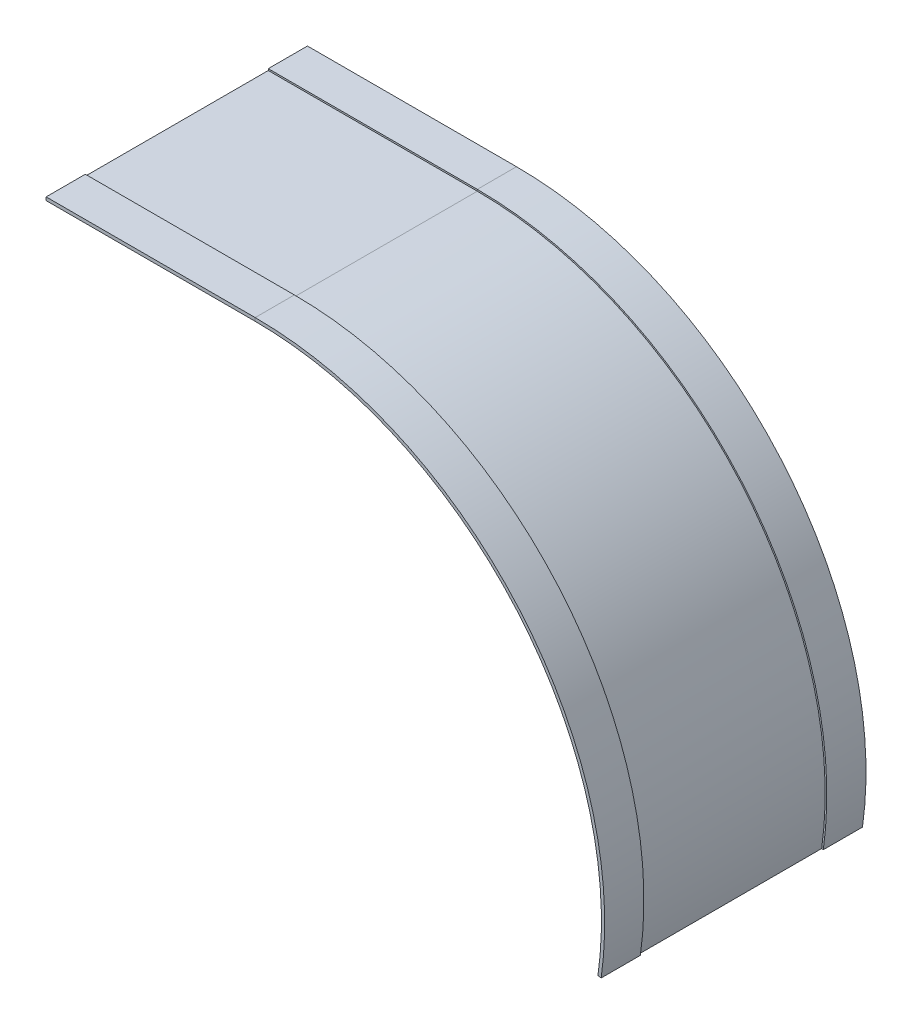
ISO-10303-21;
HEADER;
FILE_DESCRIPTION(('STEP AP214'),'2;1');
FILE_NAME('part.step','',(''),(''),'','','');
FILE_SCHEMA(('AUTOMOTIVE_DESIGN { 1 0 10303 214 1 1 1 1 }'));
ENDSEC;
DATA;
#1=APPLICATION_CONTEXT('core data for automotive mechanical design processes');
#2=APPLICATION_PROTOCOL_DEFINITION('international standard','automotive_design',2000,#1);
#3=PRODUCT_CONTEXT('',#1,'mechanical');
#4=PRODUCT('Part','Part','',(#3));
#5=PRODUCT_RELATED_PRODUCT_CATEGORY('part','',(#4));
#6=PRODUCT_DEFINITION_FORMATION('','',#4);
#7=PRODUCT_DEFINITION_CONTEXT('part definition',#1,'design');
#8=PRODUCT_DEFINITION('design','',#6,#7);
#9=PRODUCT_DEFINITION_SHAPE('','',#8);
#10=(LENGTH_UNIT() NAMED_UNIT(*) SI_UNIT(.MILLI.,.METRE.));
#11=(NAMED_UNIT(*) PLANE_ANGLE_UNIT() SI_UNIT($,.RADIAN.));
#12=(NAMED_UNIT(*) SI_UNIT($,.STERADIAN.) SOLID_ANGLE_UNIT());
#13=UNCERTAINTY_MEASURE_WITH_UNIT(LENGTH_MEASURE(1.E-05),#10,'distance_accuracy_value','');
#14=(GEOMETRIC_REPRESENTATION_CONTEXT(3) GLOBAL_UNCERTAINTY_ASSIGNED_CONTEXT((#13)) GLOBAL_UNIT_ASSIGNED_CONTEXT((#10,
#11,#12)) REPRESENTATION_CONTEXT('',''));
#15=CARTESIAN_POINT('',(0.,0.,0.));
#16=DIRECTION('',(0.,0.,1.));
#17=DIRECTION('',(1.,0.,0.));
#18=AXIS2_PLACEMENT_3D('',#15,#16,#17);
#19=CARTESIAN_POINT('',(8.12476323045138,-9.36877270608168,0.));
#20=DIRECTION('',(0.141509433962264,0.989936907130793,0.));
#21=DIRECTION('',(0.,0.,1.));
#22=AXIS2_PLACEMENT_3D('',#19,#20,#21);
#23=PLANE('',#22);
#24=DIRECTION('',(0.989936907130793,-0.141509433962264,0.));
#25=VECTOR('',#24,1.);
#26=CARTESIAN_POINT('',(168.153157887504,-32.244500828437,-63.5));
#27=LINE('',#26,#25);
#28=CARTESIAN_POINT('',(166.581633047434,-32.0198546020219,-63.5));
#29=VERTEX_POINT('',#28);
#30=CARTESIAN_POINT('',(168.153157887504,-32.244500828437,-63.5));
#31=VERTEX_POINT('',#30);
#32=EDGE_CURVE('E98',#29,#31,#27,.T.);
#33=ORIENTED_EDGE('',*,*,#32,.T.);
#34=DIRECTION('',(0.,0.,1.));
#35=VECTOR('',#34,1.);
#36=CARTESIAN_POINT('',(168.153157887504,-32.244500828437,-44.45));
#37=LINE('',#36,#35);
#38=CARTESIAN_POINT('',(168.153157887504,-32.244500828437,-44.45));
#39=VERTEX_POINT('',#38);
#40=EDGE_CURVE('E189',#31,#39,#37,.T.);
#41=ORIENTED_EDGE('',*,*,#40,.T.);
#42=DIRECTION('',(-0.989936907130793,0.141509433962264,0.));
#43=VECTOR('',#42,1.);
#44=CARTESIAN_POINT('',(167.367395467469,-32.1321777152295,-44.45));
#45=LINE('',#44,#43);
#46=CARTESIAN_POINT('',(167.367395467469,-32.1321777152295,-44.45));
#47=VERTEX_POINT('',#46);
#48=EDGE_CURVE('E180',#39,#47,#45,.T.);
#49=ORIENTED_EDGE('',*,*,#48,.T.);
#50=DIRECTION('',(0.,0.,1.));
#51=VECTOR('',#50,1.);
#52=CARTESIAN_POINT('',(167.367395467469,-32.1321777152295,44.45));
#53=LINE('',#52,#51);
#54=CARTESIAN_POINT('',(167.367395467469,-32.1321777152295,44.45));
#55=VERTEX_POINT('',#54);
#56=EDGE_CURVE('E173',#47,#55,#53,.T.);
#57=ORIENTED_EDGE('',*,*,#56,.T.);
#58=DIRECTION('',(0.989936907130793,-0.141509433962264,0.));
#59=VECTOR('',#58,1.);
#60=CARTESIAN_POINT('',(168.153157887504,-32.244500828437,44.45));
#61=LINE('',#60,#59);
#62=CARTESIAN_POINT('',(168.153157887504,-32.244500828437,44.45));
#63=VERTEX_POINT('',#62);
#64=EDGE_CURVE('E166',#55,#63,#61,.T.);
#65=ORIENTED_EDGE('',*,*,#64,.T.);
#66=DIRECTION('',(0.,0.,1.));
#67=VECTOR('',#66,1.);
#68=CARTESIAN_POINT('',(168.153157887504,-32.244500828437,63.5));
#69=LINE('',#68,#67);
#70=CARTESIAN_POINT('',(168.153157887504,-32.244500828437,63.5));
#71=VERTEX_POINT('',#70);
#72=EDGE_CURVE('E217',#63,#71,#69,.T.);
#73=ORIENTED_EDGE('',*,*,#72,.T.);
#74=DIRECTION('',(-0.989936907130793,0.141509433962264,0.));
#75=VECTOR('',#74,1.);
#76=CARTESIAN_POINT('',(166.581633047434,-32.0198546020219,63.5));
#77=LINE('',#76,#75);
#78=CARTESIAN_POINT('',(166.581633047434,-32.0198546020219,63.5));
#79=VERTEX_POINT('',#78);
#80=EDGE_CURVE('E113',#71,#79,#77,.T.);
#81=ORIENTED_EDGE('',*,*,#80,.T.);
#82=DIRECTION('',(0.,0.,-1.));
#83=VECTOR('',#82,1.);
#84=CARTESIAN_POINT('',(166.581633047434,-32.0198546020219,-63.5));
#85=LINE('',#84,#83);
#86=EDGE_CURVE('E105',#79,#29,#85,.T.);
#87=ORIENTED_EDGE('',*,*,#86,.T.);
#88=EDGE_LOOP('',(#33,#41,#49,#57,#65,#73,#81,#87));
#89=FACE_BOUND('',#88,.T.);
#90=ADVANCED_FACE('F36',(#89),#23,.F.);
#91=CARTESIAN_POINT('',(-101.6,0.,0.));
#92=DIRECTION('',(-1.,0.,0.));
#93=DIRECTION('',(0.,0.,1.));
#94=AXIS2_PLACEMENT_3D('',#91,#92,#93);
#95=PLANE('',#94);
#96=DIRECTION('',(0.,1.,0.));
#97=VECTOR('',#96,1.);
#98=CARTESIAN_POINT('',(-101.6,161.655145397978,-63.5));
#99=LINE('',#98,#97);
#100=CARTESIAN_POINT('',(-101.6,160.067645397978,-63.5));
#101=VERTEX_POINT('',#100);
#102=CARTESIAN_POINT('',(-101.6,161.655145397978,-63.5));
#103=VERTEX_POINT('',#102);
#104=EDGE_CURVE('E50',#101,#103,#99,.T.);
#105=ORIENTED_EDGE('',*,*,#104,.F.);
#106=DIRECTION('',(0.,0.,-1.));
#107=VECTOR('',#106,1.);
#108=CARTESIAN_POINT('',(-101.6,160.067645397978,-63.5));
#109=LINE('',#108,#107);
#110=CARTESIAN_POINT('',(-101.6,160.067645397978,63.5));
#111=VERTEX_POINT('',#110);
#112=EDGE_CURVE('E59',#111,#101,#109,.T.);
#113=ORIENTED_EDGE('',*,*,#112,.F.);
#114=DIRECTION('',(0.,-1.,0.));
#115=VECTOR('',#114,1.);
#116=CARTESIAN_POINT('',(-101.6,160.067645397978,63.5));
#117=LINE('',#116,#115);
#118=CARTESIAN_POINT('',(-101.6,161.655145397978,63.5));
#119=VERTEX_POINT('',#118);
#120=EDGE_CURVE('E236',#119,#111,#117,.T.);
#121=ORIENTED_EDGE('',*,*,#120,.F.);
#122=DIRECTION('',(0.,0.,1.));
#123=VECTOR('',#122,1.);
#124=CARTESIAN_POINT('',(-101.6,161.655145397978,63.5));
#125=LINE('',#124,#123);
#126=CARTESIAN_POINT('',(-101.6,161.655145397978,44.45));
#127=VERTEX_POINT('',#126);
#128=EDGE_CURVE('E125',#127,#119,#125,.T.);
#129=ORIENTED_EDGE('',*,*,#128,.F.);
#130=DIRECTION('',(0.,1.,0.));
#131=VECTOR('',#130,1.);
#132=CARTESIAN_POINT('',(-101.6,161.655145397978,44.45));
#133=LINE('',#132,#131);
#134=CARTESIAN_POINT('',(-101.6,160.861395397978,44.45));
#135=VERTEX_POINT('',#134);
#136=EDGE_CURVE('E133',#135,#127,#133,.T.);
#137=ORIENTED_EDGE('',*,*,#136,.F.);
#138=DIRECTION('',(0.,0.,1.));
#139=VECTOR('',#138,1.);
#140=CARTESIAN_POINT('',(-101.6,160.861395397978,44.45));
#141=LINE('',#140,#139);
#142=CARTESIAN_POINT('',(-101.6,160.861395397978,-44.45));
#143=VERTEX_POINT('',#142);
#144=EDGE_CURVE('E140',#143,#135,#141,.T.);
#145=ORIENTED_EDGE('',*,*,#144,.F.);
#146=DIRECTION('',(0.,-1.,0.));
#147=VECTOR('',#146,1.);
#148=CARTESIAN_POINT('',(-101.6,160.861395397978,-44.45));
#149=LINE('',#148,#147);
#150=CARTESIAN_POINT('',(-101.6,161.655145397978,-44.45));
#151=VERTEX_POINT('',#150);
#152=EDGE_CURVE('E201',#151,#143,#149,.T.);
#153=ORIENTED_EDGE('',*,*,#152,.F.);
#154=DIRECTION('',(0.,0.,1.));
#155=VECTOR('',#154,1.);
#156=CARTESIAN_POINT('',(-101.6,161.655145397978,-44.45));
#157=LINE('',#156,#155);
#158=EDGE_CURVE('E11',#103,#151,#157,.T.);
#159=ORIENTED_EDGE('',*,*,#158,.F.);
#160=EDGE_LOOP('',(#105,#113,#121,#129,#137,#145,#153,#159));
#161=FACE_BOUND('',#160,.T.);
#162=ADVANCED_FACE('F278',(#161),#95,.T.);
#163=CARTESIAN_POINT('',(167.367395467469,-32.1321777152295,-44.45));
#164=DIRECTION('',(0.,0.,-1.));
#165=DIRECTION('',(-1.,0.,0.));
#166=AXIS2_PLACEMENT_3D('',#163,#164,#165);
#167=PLANE('',#166);
#168=CARTESIAN_POINT('',(0.,-8.20735460202201,-44.45));
#169=DIRECTION('',(0.,0.,1.));
#170=DIRECTION('',(0.989936907130793,-0.141509433962264,0.));
#171=AXIS2_PLACEMENT_3D('',#168,#169,#170);
#172=CIRCLE('',#171,169.06875);
#173=CARTESIAN_POINT('',(0.,160.861395397978,-44.45));
#174=VERTEX_POINT('',#173);
#175=EDGE_CURVE('E186',#47,#174,#172,.T.);
#176=ORIENTED_EDGE('',*,*,#175,.F.);
#177=ORIENTED_EDGE('',*,*,#48,.F.);
#178=CARTESIAN_POINT('',(0.,-8.20735460202201,-44.45));
#179=DIRECTION('',(0.,0.,1.));
#180=DIRECTION('',(0.989936907130793,-0.141509433962263,0.));
#181=AXIS2_PLACEMENT_3D('',#178,#179,#180);
#182=CIRCLE('',#181,169.8625);
#183=CARTESIAN_POINT('',(0.,161.655145397978,-44.45));
#184=VERTEX_POINT('',#183);
#185=EDGE_CURVE('E185',#39,#184,#182,.T.);
#186=ORIENTED_EDGE('',*,*,#185,.T.);
#187=DIRECTION('',(0.,-1.,0.));
#188=VECTOR('',#187,1.);
#189=CARTESIAN_POINT('',(0.,160.861395397978,-44.45));
#190=LINE('',#189,#188);
#191=EDGE_CURVE('E196',#184,#174,#190,.T.);
#192=ORIENTED_EDGE('',*,*,#191,.T.);
#193=EDGE_LOOP('',(#176,#177,#186,#192));
#194=FACE_BOUND('',#193,.T.);
#195=ADVANCED_FACE('F182',(#194),#167,.F.);
#196=CARTESIAN_POINT('',(0.,-8.20735460202201,0.));
#197=DIRECTION('',(0.,0.,1.));
#198=DIRECTION('',(1.,0.,0.));
#199=AXIS2_PLACEMENT_3D('',#196,#197,#198);
#200=CYLINDRICAL_SURFACE('',#199,169.06875);
#201=CARTESIAN_POINT('',(0.,-8.20735460202201,44.45));
#202=DIRECTION('',(0.,0.,1.));
#203=DIRECTION('',(0.989936907130793,-0.141509433962264,0.));
#204=AXIS2_PLACEMENT_3D('',#201,#202,#203);
#205=CIRCLE('',#204,169.06875);
#206=CARTESIAN_POINT('',(0.,160.861395397978,44.45));
#207=VERTEX_POINT('',#206);
#208=EDGE_CURVE('E211',#55,#207,#205,.T.);
#209=ORIENTED_EDGE('',*,*,#208,.F.);
#210=ORIENTED_EDGE('',*,*,#56,.F.);
#211=ORIENTED_EDGE('',*,*,#175,.T.);
#212=DIRECTION('',(0.,0.,1.));
#213=VECTOR('',#212,1.);
#214=CARTESIAN_POINT('',(0.,160.861395397978,44.45));
#215=LINE('',#214,#213);
#216=EDGE_CURVE('E208',#174,#207,#215,.T.);
#217=ORIENTED_EDGE('',*,*,#216,.T.);
#218=EDGE_LOOP('',(#209,#210,#211,#217));
#219=FACE_BOUND('',#218,.T.);
#220=ADVANCED_FACE('F285',(#219),#200,.T.);
#221=CARTESIAN_POINT('',(168.153157887504,-32.244500828437,44.45));
#222=DIRECTION('',(0.,0.,1.));
#223=DIRECTION('',(1.,0.,0.));
#224=AXIS2_PLACEMENT_3D('',#221,#222,#223);
#225=PLANE('',#224);
#226=CARTESIAN_POINT('',(0.,-8.20735460202201,44.45));
#227=DIRECTION('',(0.,0.,1.));
#228=DIRECTION('',(0.989936907130793,-0.141509433962263,0.));
#229=AXIS2_PLACEMENT_3D('',#226,#227,#228);
#230=CIRCLE('',#229,169.8625);
#231=CARTESIAN_POINT('',(0.,161.655145397978,44.45));
#232=VERTEX_POINT('',#231);
#233=EDGE_CURVE('E220',#63,#232,#230,.T.);
#234=ORIENTED_EDGE('',*,*,#233,.F.);
#235=ORIENTED_EDGE('',*,*,#64,.F.);
#236=ORIENTED_EDGE('',*,*,#208,.T.);
#237=DIRECTION('',(0.,1.,0.));
#238=VECTOR('',#237,1.);
#239=CARTESIAN_POINT('',(0.,161.655145397978,44.45));
#240=LINE('',#239,#238);
#241=EDGE_CURVE('E213',#207,#232,#240,.T.);
#242=ORIENTED_EDGE('',*,*,#241,.T.);
#243=EDGE_LOOP('',(#234,#235,#236,#242));
#244=FACE_BOUND('',#243,.T.);
#245=ADVANCED_FACE('F297',(#244),#225,.F.);
#246=CARTESIAN_POINT('',(0.,-8.20735460202201,0.));
#247=DIRECTION('',(0.,0.,1.));
#248=DIRECTION('',(1.,0.,0.));
#249=AXIS2_PLACEMENT_3D('',#246,#247,#248);
#250=CYLINDRICAL_SURFACE('',#249,169.8625);
#251=CARTESIAN_POINT('',(0.,-8.20735460202201,63.5));
#252=DIRECTION('',(0.,0.,1.));
#253=DIRECTION('',(0.989936907130793,-0.141509433962263,0.));
#254=AXIS2_PLACEMENT_3D('',#251,#252,#253);
#255=CIRCLE('',#254,169.8625);
#256=CARTESIAN_POINT('',(0.,161.655145397978,63.5));
#257=VERTEX_POINT('',#256);
#258=EDGE_CURVE('E229',#71,#257,#255,.T.);
#259=ORIENTED_EDGE('',*,*,#258,.F.);
#260=ORIENTED_EDGE('',*,*,#72,.F.);
#261=ORIENTED_EDGE('',*,*,#233,.T.);
#262=DIRECTION('',(0.,0.,1.));
#263=VECTOR('',#262,1.);
#264=CARTESIAN_POINT('',(0.,161.655145397978,63.5));
#265=LINE('',#264,#263);
#266=EDGE_CURVE('E223',#232,#257,#265,.T.);
#267=ORIENTED_EDGE('',*,*,#266,.T.);
#268=EDGE_LOOP('',(#259,#260,#261,#267));
#269=FACE_BOUND('',#268,.T.);
#270=ADVANCED_FACE('F301',(#269),#250,.T.);
#271=CARTESIAN_POINT('',(166.581633047434,-32.0198546020219,63.5));
#272=DIRECTION('',(0.,0.,-1.));
#273=DIRECTION('',(-1.,0.,0.));
#274=AXIS2_PLACEMENT_3D('',#271,#272,#273);
#275=PLANE('',#274);
#276=CARTESIAN_POINT('',(0.,-8.20735460202201,63.5));
#277=DIRECTION('',(0.,0.,1.));
#278=DIRECTION('',(0.989936907130793,-0.141509433962264,0.));
#279=AXIS2_PLACEMENT_3D('',#276,#277,#278);
#280=CIRCLE('',#279,168.275);
#281=CARTESIAN_POINT('',(0.,160.067645397978,63.5));
#282=VERTEX_POINT('',#281);
#283=EDGE_CURVE('E240',#79,#282,#280,.T.);
#284=ORIENTED_EDGE('',*,*,#283,.F.);
#285=ORIENTED_EDGE('',*,*,#80,.F.);
#286=ORIENTED_EDGE('',*,*,#258,.T.);
#287=DIRECTION('',(0.,-1.,0.));
#288=VECTOR('',#287,1.);
#289=CARTESIAN_POINT('',(0.,160.067645397978,63.5));
#290=LINE('',#289,#288);
#291=EDGE_CURVE('E231',#257,#282,#290,.T.);
#292=ORIENTED_EDGE('',*,*,#291,.T.);
#293=EDGE_LOOP('',(#284,#285,#286,#292));
#294=FACE_BOUND('',#293,.T.);
#295=ADVANCED_FACE('F307',(#294),#275,.F.);
#296=CARTESIAN_POINT('',(0.,-8.20735460202201,0.));
#297=DIRECTION('',(0.,0.,1.));
#298=DIRECTION('',(1.,0.,0.));
#299=AXIS2_PLACEMENT_3D('',#296,#297,#298);
#300=CYLINDRICAL_SURFACE('',#299,168.275);
#301=CARTESIAN_POINT('',(0.,-8.20735460202201,-63.5));
#302=DIRECTION('',(0.,0.,1.));
#303=DIRECTION('',(0.989936907130793,-0.141509433962264,0.));
#304=AXIS2_PLACEMENT_3D('',#301,#302,#303);
#305=CIRCLE('',#304,168.275);
#306=CARTESIAN_POINT('',(0.,160.067645397978,-63.5));
#307=VERTEX_POINT('',#306);
#308=EDGE_CURVE('E248',#29,#307,#305,.T.);
#309=ORIENTED_EDGE('',*,*,#308,.F.);
#310=ORIENTED_EDGE('',*,*,#86,.F.);
#311=ORIENTED_EDGE('',*,*,#283,.T.);
#312=DIRECTION('',(0.,0.,-1.));
#313=VECTOR('',#312,1.);
#314=CARTESIAN_POINT('',(0.,160.067645397978,-63.5));
#315=LINE('',#314,#313);
#316=EDGE_CURVE('E242',#282,#307,#315,.T.);
#317=ORIENTED_EDGE('',*,*,#316,.T.);
#318=EDGE_LOOP('',(#309,#310,#311,#317));
#319=FACE_BOUND('',#318,.T.);
#320=ADVANCED_FACE('F313',(#319),#300,.F.);
#321=CARTESIAN_POINT('',(168.153157887504,-32.244500828437,-63.5));
#322=DIRECTION('',(0.,0.,1.));
#323=DIRECTION('',(1.,0.,0.));
#324=AXIS2_PLACEMENT_3D('',#321,#322,#323);
#325=PLANE('',#324);
#326=CARTESIAN_POINT('',(0.,-8.20735460202201,-63.5));
#327=DIRECTION('',(0.,0.,1.));
#328=DIRECTION('',(0.989936907130793,-0.141509433962263,0.));
#329=AXIS2_PLACEMENT_3D('',#326,#327,#328);
#330=CIRCLE('',#329,169.8625);
#331=CARTESIAN_POINT('',(0.,161.655145397978,-63.5));
#332=VERTEX_POINT('',#331);
#333=EDGE_CURVE('E256',#31,#332,#330,.T.);
#334=ORIENTED_EDGE('',*,*,#333,.F.);
#335=ORIENTED_EDGE('',*,*,#32,.F.);
#336=ORIENTED_EDGE('',*,*,#308,.T.);
#337=DIRECTION('',(0.,1.,0.));
#338=VECTOR('',#337,1.);
#339=CARTESIAN_POINT('',(0.,161.655145397978,-63.5));
#340=LINE('',#339,#338);
#341=EDGE_CURVE('E250',#307,#332,#340,.T.);
#342=ORIENTED_EDGE('',*,*,#341,.T.);
#343=EDGE_LOOP('',(#334,#335,#336,#342));
#344=FACE_BOUND('',#343,.T.);
#345=ADVANCED_FACE('F262',(#344),#325,.F.);
#346=CARTESIAN_POINT('',(0.,-8.20735460202201,0.));
#347=DIRECTION('',(0.,0.,1.));
#348=DIRECTION('',(1.,0.,0.));
#349=AXIS2_PLACEMENT_3D('',#346,#347,#348);
#350=CYLINDRICAL_SURFACE('',#349,169.8625);
#351=DIRECTION('',(0.,0.,1.));
#352=VECTOR('',#351,1.);
#353=CARTESIAN_POINT('',(0.,161.655145397978,-44.45));
#354=LINE('',#353,#352);
#355=EDGE_CURVE('E195',#332,#184,#354,.T.);
#356=ORIENTED_EDGE('',*,*,#355,.T.);
#357=ORIENTED_EDGE('',*,*,#185,.F.);
#358=ORIENTED_EDGE('',*,*,#40,.F.);
#359=ORIENTED_EDGE('',*,*,#333,.T.);
#360=EDGE_LOOP('',(#356,#357,#358,#359));
#361=FACE_BOUND('',#360,.T.);
#362=ADVANCED_FACE('F194',(#361),#350,.T.);
#363=CARTESIAN_POINT('',(0.,160.861395397978,-44.45));
#364=DIRECTION('',(0.,0.,-1.));
#365=DIRECTION('',(-1.,0.,0.));
#366=AXIS2_PLACEMENT_3D('',#363,#364,#365);
#367=PLANE('',#366);
#368=DIRECTION('',(-1.,0.,0.));
#369=VECTOR('',#368,1.);
#370=CARTESIAN_POINT('',(0.,160.861395397978,-44.45));
#371=LINE('',#370,#369);
#372=EDGE_CURVE('E156',#174,#143,#371,.T.);
#373=ORIENTED_EDGE('',*,*,#372,.F.);
#374=ORIENTED_EDGE('',*,*,#191,.F.);
#375=DIRECTION('',(-1.,0.,0.));
#376=VECTOR('',#375,1.);
#377=CARTESIAN_POINT('',(0.,161.655145397978,-44.45));
#378=LINE('',#377,#376);
#379=EDGE_CURVE('E203',#184,#151,#378,.T.);
#380=ORIENTED_EDGE('',*,*,#379,.T.);
#381=ORIENTED_EDGE('',*,*,#152,.T.);
#382=EDGE_LOOP('',(#373,#374,#380,#381));
#383=FACE_BOUND('',#382,.T.);
#384=ADVANCED_FACE('F277',(#383),#367,.F.);
#385=CARTESIAN_POINT('',(0.,160.861395397978,44.45));
#386=DIRECTION('',(0.,-1.,0.));
#387=DIRECTION('',(1.,0.,0.));
#388=AXIS2_PLACEMENT_3D('',#385,#386,#387);
#389=PLANE('',#388);
#390=DIRECTION('',(-1.,0.,0.));
#391=VECTOR('',#390,1.);
#392=CARTESIAN_POINT('',(0.,160.861395397978,44.45));
#393=LINE('',#392,#391);
#394=EDGE_CURVE('E151',#207,#135,#393,.T.);
#395=ORIENTED_EDGE('',*,*,#394,.F.);
#396=ORIENTED_EDGE('',*,*,#216,.F.);
#397=ORIENTED_EDGE('',*,*,#372,.T.);
#398=ORIENTED_EDGE('',*,*,#144,.T.);
#399=EDGE_LOOP('',(#395,#396,#397,#398));
#400=FACE_BOUND('',#399,.T.);
#401=ADVANCED_FACE('F288',(#400),#389,.F.);
#402=CARTESIAN_POINT('',(0.,161.655145397978,44.45));
#403=DIRECTION('',(0.,0.,1.));
#404=DIRECTION('',(1.,0.,0.));
#405=AXIS2_PLACEMENT_3D('',#402,#403,#404);
#406=PLANE('',#405);
#407=DIRECTION('',(-1.,0.,0.));
#408=VECTOR('',#407,1.);
#409=CARTESIAN_POINT('',(0.,161.655145397978,44.45));
#410=LINE('',#409,#408);
#411=EDGE_CURVE('E147',#232,#127,#410,.T.);
#412=ORIENTED_EDGE('',*,*,#411,.F.);
#413=ORIENTED_EDGE('',*,*,#241,.F.);
#414=ORIENTED_EDGE('',*,*,#394,.T.);
#415=ORIENTED_EDGE('',*,*,#136,.T.);
#416=EDGE_LOOP('',(#412,#413,#414,#415));
#417=FACE_BOUND('',#416,.T.);
#418=ADVANCED_FACE('F293',(#417),#406,.F.);
#419=CARTESIAN_POINT('',(0.,161.655145397978,63.5));
#420=DIRECTION('',(0.,-1.,0.));
#421=DIRECTION('',(0.,0.,-1.));
#422=AXIS2_PLACEMENT_3D('',#419,#420,#421);
#423=PLANE('',#422);
#424=DIRECTION('',(-1.,0.,0.));
#425=VECTOR('',#424,1.);
#426=CARTESIAN_POINT('',(0.,161.655145397978,63.5));
#427=LINE('',#426,#425);
#428=EDGE_CURVE('E233',#257,#119,#427,.T.);
#429=ORIENTED_EDGE('',*,*,#428,.F.);
#430=ORIENTED_EDGE('',*,*,#266,.F.);
#431=ORIENTED_EDGE('',*,*,#411,.T.);
#432=ORIENTED_EDGE('',*,*,#128,.T.);
#433=EDGE_LOOP('',(#429,#430,#431,#432));
#434=FACE_BOUND('',#433,.T.);
#435=ADVANCED_FACE('F304',(#434),#423,.F.);
#436=CARTESIAN_POINT('',(0.,160.067645397978,63.5));
#437=DIRECTION('',(0.,0.,-1.));
#438=DIRECTION('',(-1.,0.,0.));
#439=AXIS2_PLACEMENT_3D('',#436,#437,#438);
#440=PLANE('',#439);
#441=DIRECTION('',(-1.,0.,0.));
#442=VECTOR('',#441,1.);
#443=CARTESIAN_POINT('',(0.,160.067645397978,63.5));
#444=LINE('',#443,#442);
#445=EDGE_CURVE('E86',#282,#111,#444,.T.);
#446=ORIENTED_EDGE('',*,*,#445,.F.);
#447=ORIENTED_EDGE('',*,*,#291,.F.);
#448=ORIENTED_EDGE('',*,*,#428,.T.);
#449=ORIENTED_EDGE('',*,*,#120,.T.);
#450=EDGE_LOOP('',(#446,#447,#448,#449));
#451=FACE_BOUND('',#450,.T.);
#452=ADVANCED_FACE('F272',(#451),#440,.F.);
#453=CARTESIAN_POINT('',(0.,160.067645397978,-63.5));
#454=DIRECTION('',(0.,1.,0.));
#455=DIRECTION('',(-1.,0.,0.));
#456=AXIS2_PLACEMENT_3D('',#453,#454,#455);
#457=PLANE('',#456);
#458=DIRECTION('',(-1.,0.,0.));
#459=VECTOR('',#458,1.);
#460=CARTESIAN_POINT('',(0.,160.067645397978,-63.5));
#461=LINE('',#460,#459);
#462=EDGE_CURVE('E80',#307,#101,#461,.T.);
#463=ORIENTED_EDGE('',*,*,#462,.F.);
#464=ORIENTED_EDGE('',*,*,#316,.F.);
#465=ORIENTED_EDGE('',*,*,#445,.T.);
#466=ORIENTED_EDGE('',*,*,#112,.T.);
#467=EDGE_LOOP('',(#463,#464,#465,#466));
#468=FACE_BOUND('',#467,.T.);
#469=ADVANCED_FACE('F265',(#468),#457,.F.);
#470=CARTESIAN_POINT('',(0.,161.655145397978,-63.5));
#471=DIRECTION('',(0.,0.,1.));
#472=DIRECTION('',(1.,0.,0.));
#473=AXIS2_PLACEMENT_3D('',#470,#471,#472);
#474=PLANE('',#473);
#475=DIRECTION('',(-1.,0.,0.));
#476=VECTOR('',#475,1.);
#477=CARTESIAN_POINT('',(0.,161.655145397978,-63.5));
#478=LINE('',#477,#476);
#479=EDGE_CURVE('E43',#332,#103,#478,.T.);
#480=ORIENTED_EDGE('',*,*,#479,.F.);
#481=ORIENTED_EDGE('',*,*,#341,.F.);
#482=ORIENTED_EDGE('',*,*,#462,.T.);
#483=ORIENTED_EDGE('',*,*,#104,.T.);
#484=EDGE_LOOP('',(#480,#481,#482,#483));
#485=FACE_BOUND('',#484,.T.);
#486=ADVANCED_FACE('F263',(#485),#474,.F.);
#487=CARTESIAN_POINT('',(0.,161.655145397978,-44.45));
#488=DIRECTION('',(0.,-1.,0.));
#489=DIRECTION('',(0.,0.,-1.));
#490=AXIS2_PLACEMENT_3D('',#487,#488,#489);
#491=PLANE('',#490);
#492=ORIENTED_EDGE('',*,*,#158,.T.);
#493=ORIENTED_EDGE('',*,*,#379,.F.);
#494=ORIENTED_EDGE('',*,*,#355,.F.);
#495=ORIENTED_EDGE('',*,*,#479,.T.);
#496=EDGE_LOOP('',(#492,#493,#494,#495));
#497=FACE_BOUND('',#496,.T.);
#498=ADVANCED_FACE('F260',(#497),#491,.F.);
#499=CLOSED_SHELL('',(#90,#162,#195,#220,#245,#270,#295,#320,#345,#362,#384,#401,#418,#435,#452,
#469,#486,#498));
#500=MANIFOLD_SOLID_BREP('B2',#499);
#501=ADVANCED_BREP_SHAPE_REPRESENTATION('',(#18,#500),#14);
#502=SHAPE_DEFINITION_REPRESENTATION(#9,#501);
ENDSEC;
END-ISO-10303-21;
